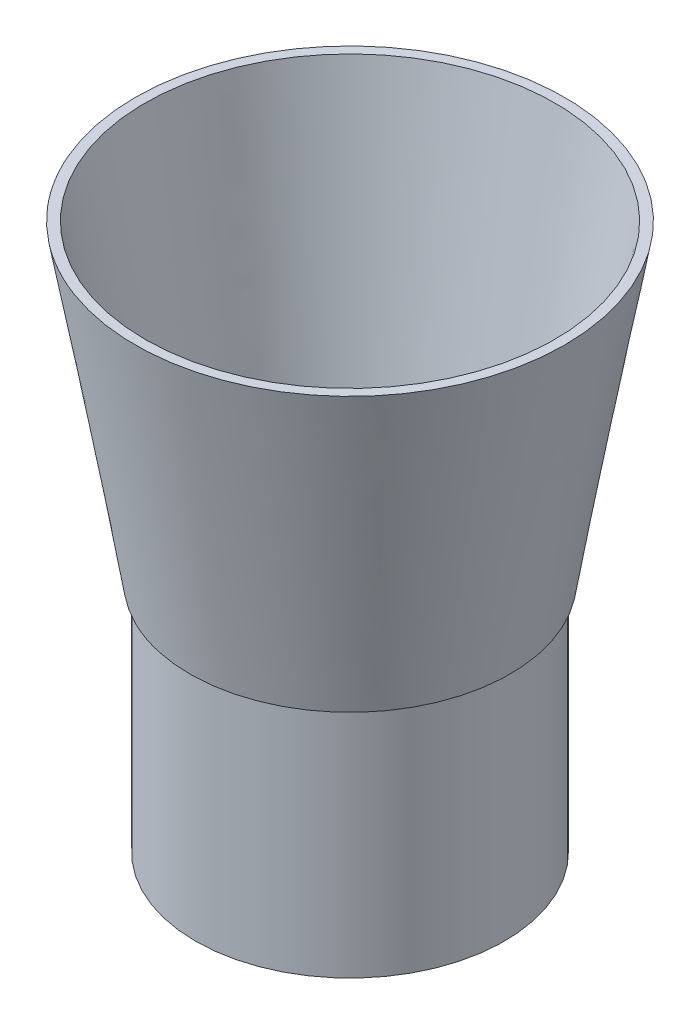
ISO-10303-21;
HEADER;
FILE_DESCRIPTION(('STEP AP214'),'2;1');
FILE_NAME('part.step','',(''),(''),'','','');
FILE_SCHEMA(('AUTOMOTIVE_DESIGN { 1 0 10303 214 1 1 1 1 }'));
ENDSEC;
DATA;
#1=APPLICATION_CONTEXT('core data for automotive mechanical design processes');
#2=APPLICATION_PROTOCOL_DEFINITION('international standard','automotive_design',2000,#1);
#3=PRODUCT_CONTEXT('',#1,'mechanical');
#4=PRODUCT('Part','Part','',(#3));
#5=PRODUCT_RELATED_PRODUCT_CATEGORY('part','',(#4));
#6=PRODUCT_DEFINITION_FORMATION('','',#4);
#7=PRODUCT_DEFINITION_CONTEXT('part definition',#1,'design');
#8=PRODUCT_DEFINITION('design','',#6,#7);
#9=PRODUCT_DEFINITION_SHAPE('','',#8);
#10=(LENGTH_UNIT() NAMED_UNIT(*) SI_UNIT(.MILLI.,.METRE.));
#11=(NAMED_UNIT(*) PLANE_ANGLE_UNIT() SI_UNIT($,.RADIAN.));
#12=(NAMED_UNIT(*) SI_UNIT($,.STERADIAN.) SOLID_ANGLE_UNIT());
#13=UNCERTAINTY_MEASURE_WITH_UNIT(LENGTH_MEASURE(1.E-05),#10,'distance_accuracy_value','');
#14=(GEOMETRIC_REPRESENTATION_CONTEXT(3) GLOBAL_UNCERTAINTY_ASSIGNED_CONTEXT((#13)) GLOBAL_UNIT_ASSIGNED_CONTEXT((#10,
#11,#12)) REPRESENTATION_CONTEXT('',''));
#15=CARTESIAN_POINT('',(0.,0.,0.));
#16=DIRECTION('',(0.,0.,1.));
#17=DIRECTION('',(1.,0.,0.));
#18=AXIS2_PLACEMENT_3D('',#15,#16,#17);
#19=CARTESIAN_POINT('',(0.,-38.1,0.));
#20=DIRECTION('',(0.,1.,0.));
#21=DIRECTION('',(0.,0.,1.));
#22=AXIS2_PLACEMENT_3D('',#19,#20,#21);
#23=CYLINDRICAL_SURFACE('',#22,23.5585);
#24=CARTESIAN_POINT('',(0.,3.175,0.));
#25=DIRECTION('',(0.,-1.,0.));
#26=DIRECTION('',(0.,0.,-1.));
#27=AXIS2_PLACEMENT_3D('',#24,#25,#26);
#28=CIRCLE('',#27,23.5585);
#29=CARTESIAN_POINT('',(0.,3.175,-23.5585));
#30=VERTEX_POINT('',#29);
#31=EDGE_CURVE('E141',#30,#30,#28,.T.);
#32=ORIENTED_EDGE('',*,*,#31,.F.);
#33=EDGE_LOOP('',(#32));
#34=FACE_BOUND('',#33,.T.);
#35=CARTESIAN_POINT('',(0.,-34.925,0.));
#36=DIRECTION('',(0.,1.,0.));
#37=DIRECTION('',(0.,0.,1.));
#38=AXIS2_PLACEMENT_3D('',#35,#36,#37);
#39=CIRCLE('',#38,23.5585);
#40=CARTESIAN_POINT('',(6.35,-34.925,-22.6865692040467));
#41=VERTEX_POINT('',#40);
#42=CARTESIAN_POINT('',(9.525,-34.925,-21.5470948679863));
#43=VERTEX_POINT('',#42);
#44=EDGE_CURVE('E89',#41,#43,#39,.F.);
#45=ORIENTED_EDGE('',*,*,#44,.T.);
#46=DIRECTION('',(0.,1.,0.));
#47=VECTOR('',#46,1.);
#48=CARTESIAN_POINT('',(9.525,-38.1,-21.5470948679863));
#49=LINE('',#48,#47);
#50=CARTESIAN_POINT('',(9.525,-38.1,-21.5470948679863));
#51=VERTEX_POINT('',#50);
#52=EDGE_CURVE('E228',#43,#51,#49,.F.);
#53=ORIENTED_EDGE('',*,*,#52,.T.);
#54=CARTESIAN_POINT('',(0.,-38.1,0.));
#55=DIRECTION('',(0.,-1.,0.));
#56=DIRECTION('',(0.,0.,-1.));
#57=AXIS2_PLACEMENT_3D('',#54,#55,#56);
#58=CIRCLE('',#57,23.5585);
#59=CARTESIAN_POINT('',(9.525,-38.1,21.5470948679863));
#60=VERTEX_POINT('',#59);
#61=EDGE_CURVE('E133',#51,#60,#58,.T.);
#62=ORIENTED_EDGE('',*,*,#61,.T.);
#63=DIRECTION('',(0.,1.,0.));
#64=VECTOR('',#63,1.);
#65=CARTESIAN_POINT('',(9.525,-38.1,21.5470948679863));
#66=LINE('',#65,#64);
#67=CARTESIAN_POINT('',(9.525,-34.925,21.5470948679863));
#68=VERTEX_POINT('',#67);
#69=EDGE_CURVE('E219',#68,#60,#66,.F.);
#70=ORIENTED_EDGE('',*,*,#69,.F.);
#71=CARTESIAN_POINT('',(0.,-34.925,0.));
#72=DIRECTION('',(0.,-1.,0.));
#73=DIRECTION('',(0.,0.,-1.));
#74=AXIS2_PLACEMENT_3D('',#71,#72,#73);
#75=CIRCLE('',#74,23.5585);
#76=CARTESIAN_POINT('',(6.35,-34.925,22.6865692040467));
#77=VERTEX_POINT('',#76);
#78=EDGE_CURVE('E120',#77,#68,#75,.F.);
#79=ORIENTED_EDGE('',*,*,#78,.F.);
#80=DIRECTION('',(0.,1.,0.));
#81=VECTOR('',#80,1.);
#82=CARTESIAN_POINT('',(6.35,-38.1,22.6865692040467));
#83=LINE('',#82,#81);
#84=CARTESIAN_POINT('',(6.35,-38.1,22.6865692040467));
#85=VERTEX_POINT('',#84);
#86=EDGE_CURVE('E131',#85,#77,#83,.T.);
#87=ORIENTED_EDGE('',*,*,#86,.F.);
#88=CARTESIAN_POINT('',(6.35,-38.1,-22.6865692040467));
#89=VERTEX_POINT('',#88);
#90=EDGE_CURVE('E118',#85,#89,#58,.T.);
#91=ORIENTED_EDGE('',*,*,#90,.T.);
#92=DIRECTION('',(0.,1.,0.));
#93=VECTOR('',#92,1.);
#94=CARTESIAN_POINT('',(6.35,-38.1,-22.6865692040467));
#95=LINE('',#94,#93);
#96=EDGE_CURVE('E124',#89,#41,#95,.T.);
#97=ORIENTED_EDGE('',*,*,#96,.T.);
#98=EDGE_LOOP('',(#45,#53,#62,#70,#79,#87,#91,#97));
#99=FACE_BOUND('',#98,.T.);
#100=ADVANCED_FACE('F67',(#34,#99),#23,.F.);
#101=CARTESIAN_POINT('',(0.,50.8,33.3375));
#102=CARTESIAN_POINT('',(0.,33.8666666666667,30.3826333333333));
#103=CARTESIAN_POINT('',(0.,16.9333333333333,27.4277666666667));
#104=CARTESIAN_POINT('',(0.,0.,24.4729));
#105=CARTESIAN_POINT('',(-0.919973332165571,50.8,33.3375));
#106=CARTESIAN_POINT('',(-0.838431568882829,33.8666666666667,30.3826333333333));
#107=CARTESIAN_POINT('',(-0.756889805600086,16.9333333333333,27.4277666666667));
#108=CARTESIAN_POINT('',(-0.675348042317343,0.,24.4729));
#109=CARTESIAN_POINT('',(-2.74261283006359,50.8,33.2628098332166));
#110=CARTESIAN_POINT('',(-2.49952155953858,33.8666666666667,30.3145633235549));
#111=CARTESIAN_POINT('',(-2.25643028901358,16.9333333333333,27.3663168138933));
#112=CARTESIAN_POINT('',(-2.01333901848857,0.,24.4180703042317));
#113=CARTESIAN_POINT('',(-5.41604312755874,50.8,32.9353115327436));
#114=CARTESIAN_POINT('',(-4.93599257479226,33.8666666666667,30.0160928089525));
#115=CARTESIAN_POINT('',(-4.45594202202578,16.9333333333333,27.0968740851614));
#116=CARTESIAN_POINT('',(-3.9758914692593,0.,24.1776553613703));
#117=CARTESIAN_POINT('',(-8.02033702564944,50.8,32.4009576320254));
#118=CARTESIAN_POINT('',(-7.30945508991569,33.8666666666667,29.5291013238154));
#119=CARTESIAN_POINT('',(-6.59857315418193,16.9333333333333,26.6572450156054));
#120=CARTESIAN_POINT('',(-5.88769121844817,0.,23.7853887073954));
#121=CARTESIAN_POINT('',(-23.1796373174517,50.8,28.0053453265603));
#122=CARTESIAN_POINT('',(-21.1251120034731,33.8666666666667,25.5230937661871));
#123=CARTESIAN_POINT('',(-19.0705866894946,16.9333333333333,23.0408422058138));
#124=CARTESIAN_POINT('',(-17.016061375516,0.,20.5585906454406));
#125=CARTESIAN_POINT('',(-33.3375,50.8,14.7195733146491));
#126=CARTESIAN_POINT('',(-30.3826333333333,33.8666666666667,13.4149051021253));
#127=CARTESIAN_POINT('',(-27.4277666666667,16.9333333333333,12.1102368896014));
#128=CARTESIAN_POINT('',(-24.4729,0.,10.8055686770776));
#129=CARTESIAN_POINT('',(-33.3375,50.8,-18.3994666433114));
#130=CARTESIAN_POINT('',(-30.3826333333333,33.8666666666667,-16.7686313776566));
#131=CARTESIAN_POINT('',(-27.4277666666667,16.9333333333333,-15.1377961120018));
#132=CARTESIAN_POINT('',(-24.4729,0.,-13.506960846347));
#133=CARTESIAN_POINT('',(-18.3994666433113,50.8,-33.3375));
#134=CARTESIAN_POINT('',(-16.7686313776566,33.8666666666667,-30.3826333333333));
#135=CARTESIAN_POINT('',(-15.1377961120018,16.9333333333333,-27.4277666666667));
#136=CARTESIAN_POINT('',(-13.506960846347,0.,-24.4729));
#137=CARTESIAN_POINT('',(18.3994666433114,50.8,-33.3375));
#138=CARTESIAN_POINT('',(16.7686313776566,33.8666666666667,-30.3826333333333));
#139=CARTESIAN_POINT('',(15.1377961120018,16.9333333333333,-27.4277666666667));
#140=CARTESIAN_POINT('',(13.506960846347,0.,-24.4729));
#141=CARTESIAN_POINT('',(33.3375,50.8,-18.3994666433113));
#142=CARTESIAN_POINT('',(30.3826333333333,33.8666666666667,-16.7686313776566));
#143=CARTESIAN_POINT('',(27.4277666666667,16.9333333333333,-15.1377961120018));
#144=CARTESIAN_POINT('',(24.4729,0.,-13.506960846347));
#145=CARTESIAN_POINT('',(33.3375,50.8,14.7195733146491));
#146=CARTESIAN_POINT('',(30.3826333333333,33.8666666666667,13.4149051021253));
#147=CARTESIAN_POINT('',(27.4277666666667,16.9333333333333,12.1102368896014));
#148=CARTESIAN_POINT('',(24.4729,0.,10.8055686770776));
#149=CARTESIAN_POINT('',(23.1796373174517,50.8,28.0053453265603));
#150=CARTESIAN_POINT('',(21.1251120034731,33.8666666666667,25.5230937661871));
#151=CARTESIAN_POINT('',(19.0705866894946,16.9333333333333,23.0408422058138));
#152=CARTESIAN_POINT('',(17.016061375516,0.,20.5585906454406));
#153=CARTESIAN_POINT('',(8.02033702564943,50.8,32.4009576320254));
#154=CARTESIAN_POINT('',(7.30945508991568,33.8666666666667,29.5291013238154));
#155=CARTESIAN_POINT('',(6.59857315418193,16.9333333333333,26.6572450156054));
#156=CARTESIAN_POINT('',(5.88769121844818,0.,23.7853887073954));
#157=CARTESIAN_POINT('',(5.41604312755872,50.8,32.9353115327436));
#158=CARTESIAN_POINT('',(4.93599257479225,33.8666666666667,30.0160928089525));
#159=CARTESIAN_POINT('',(4.45594202202578,16.9333333333333,27.0968740851614));
#160=CARTESIAN_POINT('',(3.97589146925931,0.,24.1776553613703));
#161=CARTESIAN_POINT('',(2.74261283006358,50.8,33.2628098332166));
#162=CARTESIAN_POINT('',(2.49952155953858,33.8666666666667,30.3145633235549));
#163=CARTESIAN_POINT('',(2.25643028901359,16.9333333333333,27.3663168138933));
#164=CARTESIAN_POINT('',(2.01333901848859,0.,24.4180703042317));
#165=CARTESIAN_POINT('',(0.919973332165558,50.8,33.3375));
#166=CARTESIAN_POINT('',(0.838431568882823,33.8666666666667,30.3826333333333));
#167=CARTESIAN_POINT('',(0.756889805600089,16.9333333333333,27.4277666666667));
#168=CARTESIAN_POINT('',(0.675348042317355,0.,24.4729));
#169=CARTESIAN_POINT('',(0.,50.8,33.3375));
#170=CARTESIAN_POINT('',(0.,33.8666666666667,30.3826333333333));
#171=CARTESIAN_POINT('',(0.,16.9333333333333,27.4277666666667));
#172=CARTESIAN_POINT('',(0.,0.,24.4729));
#173=B_SPLINE_SURFACE_WITH_KNOTS('',3,3,((#101,#102,#103,#104),(#105,#106,#107,#108),(#109,#110,
#111,#112),(#113,#114,#115,#116),(#117,#118,#119,#120),(#121,#122,#123,#124),(#125,#126,#127,
#128),(#129,#130,#131,#132),(#133,#134,#135,#136),(#137,#138,#139,#140),(#141,#142,#143,#144),
(#145,#146,#147,#148),(#149,#150,#151,#152),(#153,#154,#155,#156),(#157,#158,#159,#160),(#161,
#162,#163,#164),(#165,#166,#167,#168),(#169,#170,#171,#172)),.UNSPECIFIED.,.T.,.F.,.F.,(4,1,1,1,
1,2,2,2,1,1,1,1,4),(4,4),(0.,0.0125,0.0249999999999999,0.0375000000000001,0.05,0.25,0.5,0.75,
0.95,0.9625,0.975,0.9875,1.),(0.,1.),.UNSPECIFIED.);
#174=CARTESIAN_POINT('',(0.,50.8,0.));
#175=DIRECTION('',(0.,1.,0.));
#176=DIRECTION('',(0.,0.,1.));
#177=AXIS2_PLACEMENT_3D('',#174,#175,#176);
#178=CIRCLE('',#177,33.3375);
#179=CARTESIAN_POINT('',(0.,50.8,33.3375));
#180=VERTEX_POINT('',#179);
#181=EDGE_CURVE('E134',#180,#180,#178,.T.);
#182=CARTESIAN_POINT('',(0.,3.175,25.0269375));
#183=CARTESIAN_POINT('',(0.701705374786809,3.175,25.0269450791358));
#184=CARTESIAN_POINT('',(1.40332593919357,3.175,24.9979703096471));
#185=CARTESIAN_POINT('',(2.80190395204648,3.175,24.8814052967105));
#186=CARTESIAN_POINT('',(3.49886037571868,3.175,24.793802573043));
#187=CARTESIAN_POINT('',(4.88344774871142,3.175,24.5599702034702));
#188=CARTESIAN_POINT('',(5.57107065289882,3.175,24.4136929358102));
#189=CARTESIAN_POINT('',(6.93140815670746,3.175,24.0633614426326));
#190=CARTESIAN_POINT('',(7.60412347432298,3.175,23.8593100062429));
#191=CARTESIAN_POINT('',(8.92966468248353,3.175,23.3949707483957));
#192=CARTESIAN_POINT('',(9.58249548724364,3.175,23.1346969524087));
#193=CARTESIAN_POINT('',(10.8638295576875,3.175,22.5599031219465));
#194=CARTESIAN_POINT('',(11.4923324065335,3.175,22.2453821584979));
#195=CARTESIAN_POINT('',(12.7206425581829,3.175,21.5645440630064));
#196=CARTESIAN_POINT('',(13.3204490538441,3.175,21.1982254751969));
#197=CARTESIAN_POINT('',(14.4872332565809,3.175,20.4165938258074));
#198=CARTESIAN_POINT('',(15.0542109534579,3.175,20.0012807490065));
#199=CARTESIAN_POINT('',(16.151705847522,3.175,19.1245342914532));
#200=CARTESIAN_POINT('',(16.6822072014245,3.175,18.66308108091));
#201=CARTESIAN_POINT('',(17.7028340118827,3.175,17.6974981554466));
#202=CARTESIAN_POINT('',(18.1929594395279,3.175,17.1933684099691));
#203=CARTESIAN_POINT('',(19.1293656700937,3.175,16.1459756000086));
#204=CARTESIAN_POINT('',(19.5756496655977,3.175,15.6027153900521));
#205=CARTESIAN_POINT('',(20.4211927838735,3.175,14.4807511432877));
#206=CARTESIAN_POINT('',(20.8204518775619,3.175,13.9020470845592));
#207=CARTESIAN_POINT('',(21.5719453333599,3.175,12.7084096531064));
#208=CARTESIAN_POINT('',(21.9237800305325,3.175,12.0932245371615));
#209=CARTESIAN_POINT('',(22.5738885580254,3.175,10.8351628380949));
#210=CARTESIAN_POINT('',(22.8721617814811,3.175,10.1922859413208));
#211=CARTESIAN_POINT('',(23.4127597488355,3.175,8.88343504046988));
#212=CARTESIAN_POINT('',(23.6550862605962,3.175,8.21746176698131));
#213=CARTESIAN_POINT('',(24.0819019990941,3.175,6.86728174692616));
#214=CARTESIAN_POINT('',(24.2663933458875,3.175,6.18307566971495));
#215=CARTESIAN_POINT('',(24.5744462015117,3.175,4.80944235435561));
#216=CARTESIAN_POINT('',(24.6986981835827,3.175,4.12017093519377));
#217=CARTESIAN_POINT('',(24.8413438765936,3.175,3.0804473073651));
#218=CARTESIAN_POINT('',(24.8816060881447,3.175,2.7328583451482));
#219=CARTESIAN_POINT('',(24.9475716425854,3.175,2.03627767422922));
#220=CARTESIAN_POINT('',(24.9732749406855,3.175,1.68728596121499));
#221=CARTESIAN_POINT('',(25.0101551908636,3.175,0.988502964344132));
#222=CARTESIAN_POINT('',(25.0213304551133,3.175,0.638711592313337));
#223=CARTESIAN_POINT('',(25.0292726430805,3.175,-0.0610345979130219));
#224=CARTESIAN_POINT('',(25.0260395371692,3.175,-0.41098941644321));
#225=CARTESIAN_POINT('',(25.0051053976768,3.175,-1.11046929995766));
#226=CARTESIAN_POINT('',(24.9874045533164,3.175,-1.45999437050264));
#227=CARTESIAN_POINT('',(24.9374551531875,3.175,-2.15797887139648));
#228=CARTESIAN_POINT('',(24.9052066550362,3.175,-2.50643830596038));
#229=CARTESIAN_POINT('',(24.7857190742857,3.175,-3.55690893389024));
#230=CARTESIAN_POINT('',(24.6759561646261,3.175,-4.25650305417016));
#231=CARTESIAN_POINT('',(24.3971906757628,3.175,-5.64369383765209));
#232=CARTESIAN_POINT('',(24.2281882216106,3.175,-6.33129052617681));
#233=CARTESIAN_POINT('',(23.8321029208127,3.175,-7.68938756922116));
#234=CARTESIAN_POINT('',(23.6050345383353,3.175,-8.35989213569754));
#235=CARTESIAN_POINT('',(23.094534455862,3.175,-9.67908365494516));
#236=CARTESIAN_POINT('',(22.811102498739,3.175,-10.3277705081696));
#237=CARTESIAN_POINT('',(22.1937474940205,3.175,-11.5912942814294));
#238=CARTESIAN_POINT('',(21.8604507319811,3.175,-12.2064373792615));
#239=CARTESIAN_POINT('',(21.143566139313,3.175,-13.4066707760422));
#240=CARTESIAN_POINT('',(20.7599788377462,3.175,-13.9917613910559));
#241=CARTESIAN_POINT('',(19.9452571405384,3.175,-15.1280962466419));
#242=CARTESIAN_POINT('',(19.514108956941,3.175,-15.6793305997618));
#243=CARTESIAN_POINT('',(18.607464608722,3.175,-16.7440404425904));
#244=CARTESIAN_POINT('',(18.131967897793,3.175,-17.2575154670215));
#245=CARTESIAN_POINT('',(17.1351947650588,3.175,-18.2479131611413));
#246=CARTESIAN_POINT('',(16.6135230918509,3.175,-18.7244381280088));
#247=CARTESIAN_POINT('',(15.5320065486324,3.175,-19.6320037979131));
#248=CARTESIAN_POINT('',(14.9721615706375,3.175,-20.0630443722753));
#249=CARTESIAN_POINT('',(13.8183204783215,3.175,-20.8763477437594));
#250=CARTESIAN_POINT('',(13.2243338163957,3.175,-21.2586239482244));
#251=CARTESIAN_POINT('',(12.0061745748867,3.175,-21.9716168902826));
#252=CARTESIAN_POINT('',(11.3820020182284,3.175,-22.3023336670323));
#253=CARTESIAN_POINT('',(10.1076464421311,3.175,-22.909702951675));
#254=CARTESIAN_POINT('',(9.45745559072925,3.175,-23.1863390305895));
#255=CARTESIAN_POINT('',(8.13587572870225,3.175,-23.6832316494202));
#256=CARTESIAN_POINT('',(7.46448702690558,3.175,-23.9034890102846));
#257=CARTESIAN_POINT('',(6.10524701529293,3.175,-24.2860071746555));
#258=CARTESIAN_POINT('',(5.41739196756208,3.175,-24.4482546739423));
#259=CARTESIAN_POINT('',(4.03027796055835,3.175,-24.7136538391063));
#260=CARTESIAN_POINT('',(3.33101887692887,3.175,-24.8168048601154));
#261=CARTESIAN_POINT('',(2.28117595352482,3.175,-24.9266140159623));
#262=CARTESIAN_POINT('',(1.93279425772728,3.175,-24.9556959442069));
#263=CARTESIAN_POINT('',(1.2351000266477,3.175,-24.9993510937297));
#264=CARTESIAN_POINT('',(0.885787486619258,3.175,-25.0139242408847));
#265=CARTESIAN_POINT('',(0.186857677899453,3.175,-25.0286612011182));
#266=CARTESIAN_POINT('',(-0.162759592850685,3.175,-25.0288249160792));
#267=CARTESIAN_POINT('',(-0.861681893294125,3.175,-25.0147531982343));
#268=CARTESIAN_POINT('',(-1.21098692422983,3.175,-25.0005178229802));
#269=CARTESIAN_POINT('',(-2.25745466614431,3.175,-24.9360315473256));
#270=CARTESIAN_POINT('',(-2.95341219936817,3.175,-24.8640057166221));
#271=CARTESIAN_POINT('',(-4.33671959442979,3.175,-24.6618007438205));
#272=CARTESIAN_POINT('',(-5.02406975922888,3.175,-24.5316236544728));
#273=CARTESIAN_POINT('',(-6.39348371861801,3.175,-24.211858581206));
#274=CARTESIAN_POINT('',(-7.07538705483904,3.175,-24.0215814831043));
#275=CARTESIAN_POINT('',(-8.42046568849581,3.175,-23.5834790981609));
#276=CARTESIAN_POINT('',(-9.0836403092061,3.175,-23.3356517348295));
#277=CARTESIAN_POINT('',(-10.3864834893898,3.175,-22.7843802136252));
#278=CARTESIAN_POINT('',(-11.0261510894396,3.175,-22.4809337887165));
#279=CARTESIAN_POINT('',(-12.2774063867041,3.175,-21.82084477719));
#280=CARTESIAN_POINT('',(-12.8889944420436,3.175,-21.4642028692707));
#281=CARTESIAN_POINT('',(-14.0734216589049,3.175,-20.7046125611268));
#282=CARTESIAN_POINT('',(-14.6466067443244,3.175,-20.3022032754114));
#283=CARTESIAN_POINT('',(-15.7574427237345,3.175,-19.4510211815663));
#284=CARTESIAN_POINT('',(-16.2950938016161,3.175,-19.0022486134008));
#285=CARTESIAN_POINT('',(-17.3312656390269,3.175,-18.0614881842885));
#286=CARTESIAN_POINT('',(-17.8297819247501,3.175,-17.5694953960821));
#287=CARTESIAN_POINT('',(-18.7841729738812,3.175,-16.5457496717589));
#288=CARTESIAN_POINT('',(-19.2400473527359,3.175,-16.0139963771518));
#289=CARTESIAN_POINT('',(-20.1110083232271,3.175,-14.9078819526425));
#290=CARTESIAN_POINT('',(-20.5255522001033,3.175,-14.3330932924349));
#291=CARTESIAN_POINT('',(-21.3045515347232,3.175,-13.1505127058323));
#292=CARTESIAN_POINT('',(-21.6690066806883,3.175,-12.5427205740391));
#293=CARTESIAN_POINT('',(-22.3449070021907,3.175,-11.2985286197747));
#294=CARTESIAN_POINT('',(-22.6563656639127,3.175,-10.6621361275934));
#295=CARTESIAN_POINT('',(-23.2239017468371,3.175,-9.3651446778615));
#296=CARTESIAN_POINT('',(-23.4799797673799,3.175,-8.70454598236577));
#297=CARTESIAN_POINT('',(-23.9330459815379,3.175,-7.36884948461068));
#298=CARTESIAN_POINT('',(-24.1304654032092,3.175,-6.69389867210003));
#299=CARTESIAN_POINT('',(-24.3830968551597,3.175,-5.67096950589377));
#300=CARTESIAN_POINT('',(-24.4600600180103,3.175,-5.32822817757063));
#301=CARTESIAN_POINT('',(-24.5994243953554,3.175,-4.63970953039639));
#302=CARTESIAN_POINT('',(-24.661822097251,3.175,-4.29393150003414));
#303=CARTESIAN_POINT('',(-24.8270086307116,3.175,-3.25301512699823));
#304=CARTESIAN_POINT('',(-24.9077970417377,3.175,-2.5542695624095));
#305=CARTESIAN_POINT('',(-25.0106311677722,3.175,-1.15246685249484));
#306=CARTESIAN_POINT('',(-25.0326743499363,3.175,-0.449409522573803));
#307=CARTESIAN_POINT('',(-25.02217907842,3.175,0.604954245986891));
#308=CARTESIAN_POINT('',(-25.0114001490469,3.175,0.956592735264008));
#309=CARTESIAN_POINT('',(-24.9751653938538,3.175,1.65911189859596));
#310=CARTESIAN_POINT('',(-24.9497095878077,3.175,2.00999257367116));
#311=CARTESIAN_POINT('',(-24.85124522667,3.175,3.0605004747403));
#312=CARTESIAN_POINT('',(-24.7561378673959,3.175,3.75818990576825));
#313=CARTESIAN_POINT('',(-24.507227570891,3.175,5.14270387810632));
#314=CARTESIAN_POINT('',(-24.353443587067,3.175,5.8295318532947));
#315=CARTESIAN_POINT('',(-23.9881017493442,3.175,7.18768942292545));
#316=CARTESIAN_POINT('',(-23.7765426060889,3.175,7.85901867112323));
#317=CARTESIAN_POINT('',(-23.2975051565529,3.175,9.18050370215012));
#318=CARTESIAN_POINT('',(-23.030093801185,3.175,9.83068376803472));
#319=CARTESIAN_POINT('',(-22.4412880751522,3.175,11.1061163165658));
#320=CARTESIAN_POINT('',(-22.1198937880044,3.175,11.7313688377758));
#321=CARTESIAN_POINT('',(-21.4255498046442,3.175,12.9527404430437));
#322=CARTESIAN_POINT('',(-21.0525883836637,3.175,13.5488528597041));
#323=CARTESIAN_POINT('',(-20.2580013016942,3.175,14.7077066612201));
#324=CARTESIAN_POINT('',(-19.8363754337913,3.175,15.270447904171));
#325=CARTESIAN_POINT('',(-18.9474417263772,3.175,16.3588570453129));
#326=CARTESIAN_POINT('',(-18.4801217881599,3.175,16.8845150609755));
#327=CARTESIAN_POINT('',(-17.5032182270571,3.175,17.8949719243631));
#328=CARTESIAN_POINT('',(-16.9936345061166,3.175,18.3797706772862));
#329=CARTESIAN_POINT('',(-15.9356457839046,3.175,19.305179542357));
#330=CARTESIAN_POINT('',(-15.3872338975528,3.175,19.745781783855));
#331=CARTESIAN_POINT('',(-14.2554343367315,3.175,20.5794968534423));
#332=CARTESIAN_POINT('',(-13.6720470830605,3.175,20.9726102527118));
#333=CARTESIAN_POINT('',(-12.4695772591685,3.175,21.7112903124134));
#334=CARTESIAN_POINT('',(-11.8502505469095,3.175,22.0564597419524));
#335=CARTESIAN_POINT('',(-10.5844285441314,3.175,22.6928718782398));
#336=CARTESIAN_POINT('',(-9.9379314461459,3.175,22.984110990371));
#337=CARTESIAN_POINT('',(-8.62320432415374,3.175,23.5099956299683));
#338=CARTESIAN_POINT('',(-7.95500149141297,3.175,23.7447090842491));
#339=CARTESIAN_POINT('',(-6.60121052546885,3.175,24.1561220046403));
#340=CARTESIAN_POINT('',(-5.91562714036711,3.175,24.3328371348958));
#341=CARTESIAN_POINT('',(-4.36603033402228,3.175,24.6623880064683));
#342=CARTESIAN_POINT('',(-3.49860223323708,3.175,24.7993724949378));
#343=CARTESIAN_POINT('',(-1.75407301251944,3.175,24.981650304784));
#344=CARTESIAN_POINT('',(-0.87697027253916,3.175,25.026928027824));
#345=CARTESIAN_POINT('',(0.,3.175,25.0269375));
#346=B_SPLINE_CURVE_WITH_KNOTS('',3,(#182,#183,#184,#185,#186,#187,#188,#189,#190,#191,#192,
#193,#194,#195,#196,#197,#198,#199,#200,#201,#202,#203,#204,#205,#206,#207,#208,#209,#210,#211,
#212,#213,#214,#215,#216,#217,#218,#219,#220,#221,#222,#223,#224,#225,#226,#227,#228,#229,#230,
#231,#232,#233,#234,#235,#236,#237,#238,#239,#240,#241,#242,#243,#244,#245,#246,#247,#248,#249,
#250,#251,#252,#253,#254,#255,#256,#257,#258,#259,#260,#261,#262,#263,#264,#265,#266,#267,#268,
#269,#270,#271,#272,#273,#274,#275,#276,#277,#278,#279,#280,#281,#282,#283,#284,#285,#286,#287,
#288,#289,#290,#291,#292,#293,#294,#295,#296,#297,#298,#299,#300,#301,#302,#303,#304,#305,#306,
#307,#308,#309,#310,#311,#312,#313,#314,#315,#316,#317,#318,#319,#320,#321,#322,#323,#324,#325,
#326,#327,#328,#329,#330,#331,#332,#333,#334,#335,#336,#337,#338,#339,#340,#341,#342,#343,#344,
#345),.UNSPECIFIED.,.T.,.F.,(4,2,2,2,2,2,2,2,2,2,2,2,2,2,2,2,2,2,2,2,2,2,2,2,2,2,2,2,2,2,2,2,2,
2,2,2,2,2,2,2,2,2,2,2,2,2,2,2,2,2,2,2,2,2,2,2,2,2,2,2,2,2,2,2,2,2,2,2,2,2,2,2,2,2,2,2,2,2,2,2,2,
4),(0.,2.10434977682889,4.20914765226579,6.31565730310995,8.42206527662451,10.5279483821871,
12.6338675542106,14.7398459246264,16.8458249492913,18.9527129895846,21.0596025384718,
23.1663385473345,25.2730758591369,27.3965847881754,29.5201177755752,31.6435836522059,
33.7669716801148,35.8654091865468,36.9148974773471,37.9643889968178,39.0140024325347,
40.0636180266332,41.1132198932296,42.1628176028253,44.2844795709549,46.4061370603974,
48.5272665608913,50.648405738065,52.7448486437667,54.8412694964338,56.9382997091733,
59.0353557575875,61.1525199710429,63.269690173761,65.3862770183758,67.5028622555501,
69.6200894866838,71.7372858864477,73.8549675417183,75.9726723049492,77.0212051394018,
78.0697433306255,79.1182886616068,80.1668298016723,82.2631876295963,84.35947146154,
86.4807218776041,88.6020488430855,90.7234622931966,92.8448486794064,94.9434260238749,
97.0419925071987,99.1407985458623,101.239623510152,103.363130821049,105.48665134917,
107.609630687447,109.732587049268,111.839526740498,112.893084075029,113.946895223002,
116.054440709256,118.162077062439,119.217222409164,120.272366334305,122.382067041517,
124.491086860711,126.600153750318,128.706706831284,130.813256653237,132.920286229398,
135.027324764663,137.134922712319,139.242525549897,141.350503051958,143.458455197435,
145.582945520405,147.707577396088,149.829643219805,151.951135444991,154.580641291331,
157.210594350853),.UNSPECIFIED.);
#347=CARTESIAN_POINT('',(0.,3.175,25.0269375));
#348=VERTEX_POINT('',#347);
#349=EDGE_CURVE('E13',#348,#348,#346,.T.);
#350=ORIENTED_EDGE('',*,*,#181,.T.);
#351=EDGE_LOOP('',(#350));
#352=FACE_BOUND('',#351,.T.);
#353=ORIENTED_EDGE('',*,*,#349,.F.);
#354=EDGE_LOOP('',(#353));
#355=FACE_BOUND('',#354,.T.);
#356=ADVANCED_FACE('F188',(#352,#355),#173,.F.);
#357=CARTESIAN_POINT('',(0.,50.8,0.));
#358=DIRECTION('',(0.,1.,0.));
#359=DIRECTION('',(0.,0.,1.));
#360=AXIS2_PLACEMENT_3D('',#357,#358,#359);
#361=PLANE('',#360);
#362=ORIENTED_EDGE('',*,*,#181,.F.);
#363=EDGE_LOOP('',(#362));
#364=FACE_BOUND('',#363,.T.);
#365=CARTESIAN_POINT('',(0.,50.8,0.));
#366=DIRECTION('',(0.,1.,0.));
#367=DIRECTION('',(0.,0.,1.));
#368=AXIS2_PLACEMENT_3D('',#365,#366,#367);
#369=CIRCLE('',#368,34.925);
#370=CARTESIAN_POINT('',(24.0672997579281,50.8,-25.3085105717826));
#371=VERTEX_POINT('',#370);
#372=EDGE_CURVE('E154',#371,#371,#369,.T.);
#373=ORIENTED_EDGE('',*,*,#372,.T.);
#374=EDGE_LOOP('',(#373));
#375=FACE_BOUND('',#374,.T.);
#376=ADVANCED_FACE('F69',(#364,#375),#361,.T.);
#377=CARTESIAN_POINT('',(0.,0.,0.));
#378=DIRECTION('',(0.,1.,0.));
#379=DIRECTION('',(0.,0.,1.));
#380=AXIS2_PLACEMENT_3D('',#377,#378,#379);
#381=PLANE('',#380);
#382=CARTESIAN_POINT('',(0.,0.,0.));
#383=DIRECTION('',(0.,1.,0.));
#384=DIRECTION('',(0.,0.,1.));
#385=AXIS2_PLACEMENT_3D('',#382,#383,#384);
#386=CIRCLE('',#385,25.146);
#387=CARTESIAN_POINT('',(0.,0.,25.146));
#388=VERTEX_POINT('',#387);
#389=EDGE_CURVE('E82',#388,#388,#386,.F.);
#390=ORIENTED_EDGE('',*,*,#389,.F.);
#391=EDGE_LOOP('',(#390));
#392=FACE_BOUND('',#391,.T.);
#393=CARTESIAN_POINT('',(0.,0.,0.));
#394=DIRECTION('',(0.,1.,0.));
#395=DIRECTION('',(0.,0.,1.));
#396=AXIS2_PLACEMENT_3D('',#393,#394,#395);
#397=CIRCLE('',#396,26.0604);
#398=CARTESIAN_POINT('',(13.9776830721426,0.,-21.9947453746284));
#399=VERTEX_POINT('',#398);
#400=EDGE_CURVE('E149',#399,#399,#397,.T.);
#401=ORIENTED_EDGE('',*,*,#400,.F.);
#402=EDGE_LOOP('',(#401));
#403=FACE_BOUND('',#402,.T.);
#404=ADVANCED_FACE('F170',(#392,#403),#381,.F.);
#405=CARTESIAN_POINT('',(13.9776830721426,0.,-21.9947453746284));
#406=CARTESIAN_POINT('',(24.0672997579281,50.8,-25.3085105717826));
#407=CARTESIAN_POINT('',(-30.0118076771142,0.,-49.9501115189136));
#408=CARTESIAN_POINT('',(-26.5497213856371,50.8,-73.4431100876389));
#409=CARTESIAN_POINT('',(-57.9671738213994,0.,-5.96062076965677));
#410=CARTESIAN_POINT('',(-74.6843209014934,50.8,-22.8260889440737));
#411=CARTESIAN_POINT('',(-13.9776830721426,0.,21.9947453746284));
#412=CARTESIAN_POINT('',(-24.0672997579281,50.8,25.3085105717826));
#413=CARTESIAN_POINT('',(30.0118076771142,0.,49.9501115189136));
#414=CARTESIAN_POINT('',(26.5497213856371,50.8,73.4431100876389));
#415=CARTESIAN_POINT('',(57.9671738213994,0.,5.96062076965677));
#416=CARTESIAN_POINT('',(74.6843209014934,50.8,22.8260889440736));
#417=CARTESIAN_POINT('',(13.9776830721426,0.,-21.9947453746284));
#418=CARTESIAN_POINT('',(24.0672997579281,50.8,-25.3085105717826));
#419=(BOUNDED_SURFACE() B_SPLINE_SURFACE(3,1,((#405,#406),(#407,#408),(#409,#410),(#411,#412),
(#413,#414),(#415,#416),(#417,#418)),.UNSPECIFIED.,.T.,.F.,.F.) B_SPLINE_SURFACE_WITH_KNOTS((4,
3,4),(2,2),(0.,0.5,1.),(0.,1.),
.UNSPECIFIED.) GEOMETRIC_REPRESENTATION_ITEM() RATIONAL_B_SPLINE_SURFACE(((1.,1.),
(0.333333333333333,0.333333333333333),(0.333333333333333,0.333333333333333),(1.,1.),
(0.333333333333333,0.333333333333333),(0.333333333333333,0.333333333333333),(1.,1.))) REPRESENTATION_ITEM('') SURFACE());
#420=CARTESIAN_POINT('',(13.9776830721426,0.,-21.9947453746284));
#421=CARTESIAN_POINT('',(14.0827832459529,0.529166666666666,-22.0292637620988));
#422=CARTESIAN_POINT('',(14.1878834197631,1.05833333333333,-22.0637821495691));
#423=CARTESIAN_POINT('',(14.3980837673837,2.11666666666667,-22.1328189245098));
#424=CARTESIAN_POINT('',(14.5031839411939,2.64583333333333,-22.1673373119802));
#425=CARTESIAN_POINT('',(14.7133842888145,3.70416666666667,-22.2363740869209));
#426=CARTESIAN_POINT('',(14.8184844626247,4.23333333333333,-22.2708924743913));
#427=CARTESIAN_POINT('',(15.0286848102453,5.29166666666667,-22.339929249332));
#428=CARTESIAN_POINT('',(15.1337849840555,5.82083333333333,-22.3744476368023));
#429=CARTESIAN_POINT('',(15.3439853316761,6.87916666666667,-22.4434844117431));
#430=CARTESIAN_POINT('',(15.4490855054863,7.40833333333333,-22.4780027992134));
#431=CARTESIAN_POINT('',(15.6592858531069,8.46666666666667,-22.5470395741541));
#432=CARTESIAN_POINT('',(15.7643860269171,8.99583333333333,-22.5815579616245));
#433=CARTESIAN_POINT('',(15.9745863745377,10.0541666666667,-22.6505947365652));
#434=CARTESIAN_POINT('',(16.0796865483479,10.5833333333333,-22.6851131240355));
#435=CARTESIAN_POINT('',(16.2898868959684,11.6416666666667,-22.7541498989763));
#436=CARTESIAN_POINT('',(16.3949870697787,12.1708333333333,-22.7886682864466));
#437=CARTESIAN_POINT('',(16.6051874173992,13.2291666666667,-22.8577050613873));
#438=CARTESIAN_POINT('',(16.7102875912095,13.7583333333333,-22.8922234488577));
#439=CARTESIAN_POINT('',(16.92048793883,14.8166666666667,-22.9612602237984));
#440=CARTESIAN_POINT('',(17.0255881126403,15.3458333333333,-22.9957786112687));
#441=CARTESIAN_POINT('',(17.2357884602608,16.4041666666667,-23.0648153862095));
#442=CARTESIAN_POINT('',(17.3408886340711,16.9333333333333,-23.0993337736798));
#443=CARTESIAN_POINT('',(17.5510889816916,17.9916666666667,-23.1683705486205));
#444=CARTESIAN_POINT('',(17.6561891555019,18.5208333333333,-23.2028889360909));
#445=CARTESIAN_POINT('',(17.8663895031224,19.5791666666667,-23.2719257110316));
#446=CARTESIAN_POINT('',(17.9714896769327,20.1083333333333,-23.306444098502));
#447=CARTESIAN_POINT('',(18.1816900245532,21.1666666666667,-23.3754808734427));
#448=CARTESIAN_POINT('',(18.2867901983635,21.6958333333333,-23.409999260913));
#449=CARTESIAN_POINT('',(18.496990545984,22.7541666666667,-23.4790360358537));
#450=CARTESIAN_POINT('',(18.6020907197943,23.2833333333333,-23.5135544233241));
#451=CARTESIAN_POINT('',(18.8122910674148,24.3416666666667,-23.5825911982648));
#452=CARTESIAN_POINT('',(18.9173912412251,24.8708333333333,-23.6171095857352));
#453=CARTESIAN_POINT('',(19.1275915888456,25.9291666666667,-23.6861463606759));
#454=CARTESIAN_POINT('',(19.2326917626559,26.4583333333333,-23.7206647481462));
#455=CARTESIAN_POINT('',(19.4428921102764,27.5166666666667,-23.7897015230869));
#456=CARTESIAN_POINT('',(19.5479922840867,28.0458333333333,-23.8242199105573));
#457=CARTESIAN_POINT('',(19.7581926317072,29.1041666666667,-23.893256685498));
#458=CARTESIAN_POINT('',(19.8632928055175,29.6333333333333,-23.9277750729684));
#459=CARTESIAN_POINT('',(20.073493153138,30.6916666666667,-23.9968118479091));
#460=CARTESIAN_POINT('',(20.1785933269483,31.2208333333333,-24.0313302353794));
#461=CARTESIAN_POINT('',(20.3887936745688,32.2791666666667,-24.1003670103201));
#462=CARTESIAN_POINT('',(20.4938938483791,32.8083333333333,-24.1348853977905));
#463=CARTESIAN_POINT('',(20.7040941959996,33.8666666666667,-24.2039221727312));
#464=CARTESIAN_POINT('',(20.8091943698099,34.3958333333333,-24.2384405602016));
#465=CARTESIAN_POINT('',(21.0193947174304,35.4541666666667,-24.3074773351423));
#466=CARTESIAN_POINT('',(21.1244948912407,35.9833333333333,-24.3419957226126));
#467=CARTESIAN_POINT('',(21.3346952388612,37.0416666666667,-24.4110324975533));
#468=CARTESIAN_POINT('',(21.4397954126715,37.5708333333333,-24.4455508850237));
#469=CARTESIAN_POINT('',(21.649995760292,38.6291666666667,-24.5145876599644));
#470=CARTESIAN_POINT('',(21.7550959341023,39.1583333333333,-24.5491060474348));
#471=CARTESIAN_POINT('',(21.9652962817228,40.2166666666667,-24.6181428223755));
#472=CARTESIAN_POINT('',(22.0703964555331,40.7458333333333,-24.6526612098458));
#473=CARTESIAN_POINT('',(22.2805968031536,41.8041666666667,-24.7216979847865));
#474=CARTESIAN_POINT('',(22.3856969769639,42.3333333333333,-24.7562163722569));
#475=CARTESIAN_POINT('',(22.5958973245844,43.3916666666667,-24.8252531471976));
#476=CARTESIAN_POINT('',(22.7009974983947,43.9208333333333,-24.859771534668));
#477=CARTESIAN_POINT('',(22.9111978460152,44.9791666666667,-24.9288083096087));
#478=CARTESIAN_POINT('',(23.0162980198255,45.5083333333333,-24.963326697079));
#479=CARTESIAN_POINT('',(23.226498367446,46.5666666666667,-25.0323634720198));
#480=CARTESIAN_POINT('',(23.3315985412563,47.0958333333333,-25.0668818594901));
#481=CARTESIAN_POINT('',(23.5417988888768,48.1541666666667,-25.1359186344308));
#482=CARTESIAN_POINT('',(23.6468990626871,48.6833333333333,-25.1704370219012));
#483=CARTESIAN_POINT('',(23.8570994103076,49.7416666666667,-25.2394737968419));
#484=CARTESIAN_POINT('',(23.9621995841179,50.2708333333333,-25.2739921843122));
#485=CARTESIAN_POINT('',(24.0672997579281,50.8,-25.3085105717826));
#486=B_SPLINE_CURVE_WITH_KNOTS('',3,(#420,#421,#422,#423,#424,#425,#426,#427,#428,#429,#430,
#431,#432,#433,#434,#435,#436,#437,#438,#439,#440,#441,#442,#443,#444,#445,#446,#447,#448,#449,
#450,#451,#452,#453,#454,#455,#456,#457,#458,#459,#460,#461,#462,#463,#464,#465,#466,#467,#468,
#469,#470,#471,#472,#473,#474,#475,#476,#477,#478,#479,#480,#481,#482,#483,#484,#485),
.UNSPECIFIED.,.F.,.F.,(4,2,2,2,2,2,2,2,2,2,2,2,2,2,2,2,2,2,2,2,2,2,2,2,2,2,2,2,2,2,2,2,4),(0.,
1.6218182205403,3.24363644108061,4.86545466162091,6.48727288216121,8.10909110270152,
9.73090932324182,11.3527275437821,12.9745457643224,14.5963639848627,16.218182205403,
17.8400004259433,19.4618186464836,21.0836368670239,22.7054550875642,24.3272733081045,
25.9490915286448,27.5709097491852,29.1927279697255,30.8145461902658,32.4363644108061,
34.0581826313464,35.6800008518867,37.301819072427,38.9236372929673,40.5454555135076,
42.1672737340479,43.7890919545882,45.4109101751285,47.0327283956688,48.6545466162091,
50.2763648367494,51.8981830572897),.UNSPECIFIED.);
#487=EDGE_CURVE('BSEAM159',#399,#371,#486,.T.);
#488=ORIENTED_EDGE('',*,*,#400,.T.);
#489=ORIENTED_EDGE('',*,*,#372,.F.);
#490=ORIENTED_EDGE('',*,*,#487,.T.);
#491=ORIENTED_EDGE('',*,*,#487,.F.);
#492=EDGE_LOOP('',(#488,#490,#489,#491));
#493=FACE_BOUND('',#492,.T.);
#494=ADVANCED_FACE('F159',(#493),#419,.T.);
#495=CARTESIAN_POINT('',(0.,-38.1,0.));
#496=DIRECTION('',(0.,-1.,0.));
#497=DIRECTION('',(0.,0.,-1.));
#498=AXIS2_PLACEMENT_3D('',#495,#496,#497);
#499=PLANE('',#498);
#500=ORIENTED_EDGE('',*,*,#90,.F.);
#501=DIRECTION('',(0.,0.,-1.));
#502=VECTOR('',#501,1.);
#503=CARTESIAN_POINT('',(6.35,-38.1,40.9406601391165));
#504=LINE('',#503,#502);
#505=EDGE_CURVE('E97',#85,#89,#504,.T.);
#506=ORIENTED_EDGE('',*,*,#505,.T.);
#507=EDGE_LOOP('',(#500,#506));
#508=FACE_BOUND('',#507,.T.);
#509=CARTESIAN_POINT('',(0.,-38.1,0.));
#510=DIRECTION('',(0.,-1.,0.));
#511=DIRECTION('',(0.,0.,-1.));
#512=AXIS2_PLACEMENT_3D('',#509,#510,#511);
#513=CIRCLE('',#512,25.146);
#514=CARTESIAN_POINT('',(0.,-38.1,25.146));
#515=VERTEX_POINT('',#514);
#516=EDGE_CURVE('E139',#515,#515,#513,.T.);
#517=ORIENTED_EDGE('',*,*,#516,.T.);
#518=EDGE_LOOP('',(#517));
#519=FACE_BOUND('',#518,.T.);
#520=ORIENTED_EDGE('',*,*,#61,.F.);
#521=DIRECTION('',(0.,0.,-1.));
#522=VECTOR('',#521,1.);
#523=CARTESIAN_POINT('',(9.525,-38.1,40.9406601391165));
#524=LINE('',#523,#522);
#525=EDGE_CURVE('E121',#60,#51,#524,.T.);
#526=ORIENTED_EDGE('',*,*,#525,.F.);
#527=EDGE_LOOP('',(#520,#526));
#528=FACE_BOUND('',#527,.T.);
#529=ADVANCED_FACE('F115',(#508,#519,#528),#499,.T.);
#530=CARTESIAN_POINT('',(0.,-38.1,0.));
#531=DIRECTION('',(0.,1.,0.));
#532=DIRECTION('',(0.,0.,1.));
#533=AXIS2_PLACEMENT_3D('',#530,#531,#532);
#534=CYLINDRICAL_SURFACE('',#533,25.146);
#535=CARTESIAN_POINT('',(0.,-38.1,25.146));
#536=CARTESIAN_POINT('',(0.,-37.703125,25.146));
#537=CARTESIAN_POINT('',(0.,-37.30625,25.146));
#538=CARTESIAN_POINT('',(0.,-36.5125,25.146));
#539=CARTESIAN_POINT('',(0.,-36.115625,25.146));
#540=CARTESIAN_POINT('',(0.,-35.321875,25.146));
#541=CARTESIAN_POINT('',(0.,-34.925,25.146));
#542=CARTESIAN_POINT('',(0.,-34.13125,25.146));
#543=CARTESIAN_POINT('',(0.,-33.734375,25.146));
#544=CARTESIAN_POINT('',(0.,-32.940625,25.146));
#545=CARTESIAN_POINT('',(0.,-32.54375,25.146));
#546=CARTESIAN_POINT('',(0.,-31.75,25.146));
#547=CARTESIAN_POINT('',(0.,-31.353125,25.146));
#548=CARTESIAN_POINT('',(0.,-30.559375,25.146));
#549=CARTESIAN_POINT('',(0.,-30.1625,25.146));
#550=CARTESIAN_POINT('',(0.,-29.36875,25.146));
#551=CARTESIAN_POINT('',(0.,-28.971875,25.146));
#552=CARTESIAN_POINT('',(0.,-28.178125,25.146));
#553=CARTESIAN_POINT('',(0.,-27.78125,25.146));
#554=CARTESIAN_POINT('',(0.,-26.9875,25.146));
#555=CARTESIAN_POINT('',(0.,-26.590625,25.146));
#556=CARTESIAN_POINT('',(0.,-25.796875,25.146));
#557=CARTESIAN_POINT('',(0.,-25.4,25.146));
#558=CARTESIAN_POINT('',(0.,-24.60625,25.146));
#559=CARTESIAN_POINT('',(0.,-24.209375,25.146));
#560=CARTESIAN_POINT('',(0.,-23.415625,25.146));
#561=CARTESIAN_POINT('',(0.,-23.01875,25.146));
#562=CARTESIAN_POINT('',(0.,-22.225,25.146));
#563=CARTESIAN_POINT('',(0.,-21.828125,25.146));
#564=CARTESIAN_POINT('',(0.,-21.034375,25.146));
#565=CARTESIAN_POINT('',(0.,-20.6375,25.146));
#566=CARTESIAN_POINT('',(0.,-19.84375,25.146));
#567=CARTESIAN_POINT('',(0.,-19.446875,25.146));
#568=CARTESIAN_POINT('',(0.,-18.653125,25.146));
#569=CARTESIAN_POINT('',(0.,-18.25625,25.146));
#570=CARTESIAN_POINT('',(0.,-17.4625,25.146));
#571=CARTESIAN_POINT('',(0.,-17.065625,25.146));
#572=CARTESIAN_POINT('',(0.,-16.271875,25.146));
#573=CARTESIAN_POINT('',(0.,-15.875,25.146));
#574=CARTESIAN_POINT('',(0.,-15.08125,25.146));
#575=CARTESIAN_POINT('',(0.,-14.684375,25.146));
#576=CARTESIAN_POINT('',(0.,-13.890625,25.146));
#577=CARTESIAN_POINT('',(0.,-13.49375,25.146));
#578=CARTESIAN_POINT('',(0.,-12.7,25.146));
#579=CARTESIAN_POINT('',(0.,-12.303125,25.146));
#580=CARTESIAN_POINT('',(0.,-11.509375,25.146));
#581=CARTESIAN_POINT('',(0.,-11.1125,25.146));
#582=CARTESIAN_POINT('',(0.,-10.31875,25.146));
#583=CARTESIAN_POINT('',(0.,-9.92187499999999,25.146));
#584=CARTESIAN_POINT('',(0.,-9.128125,25.146));
#585=CARTESIAN_POINT('',(0.,-8.73124999999999,25.146));
#586=CARTESIAN_POINT('',(0.,-7.93749999999999,25.146));
#587=CARTESIAN_POINT('',(0.,-7.54062499999999,25.146));
#588=CARTESIAN_POINT('',(0.,-6.746875,25.146));
#589=CARTESIAN_POINT('',(0.,-6.35,25.146));
#590=CARTESIAN_POINT('',(0.,-5.55625,25.146));
#591=CARTESIAN_POINT('',(0.,-5.159375,25.146));
#592=CARTESIAN_POINT('',(0.,-4.365625,25.146));
#593=CARTESIAN_POINT('',(0.,-3.96875,25.146));
#594=CARTESIAN_POINT('',(0.,-3.175,25.146));
#595=CARTESIAN_POINT('',(0.,-2.778125,25.146));
#596=CARTESIAN_POINT('',(0.,-1.984375,25.146));
#597=CARTESIAN_POINT('',(0.,-1.5875,25.146));
#598=CARTESIAN_POINT('',(0.,-0.79375,25.146));
#599=CARTESIAN_POINT('',(0.,-0.396875,25.146));
#600=CARTESIAN_POINT('',(0.,0.,25.146));
#601=B_SPLINE_CURVE_WITH_KNOTS('',3,(#535,#536,#537,#538,#539,#540,#541,#542,#543,#544,#545,
#546,#547,#548,#549,#550,#551,#552,#553,#554,#555,#556,#557,#558,#559,#560,#561,#562,#563,#564,
#565,#566,#567,#568,#569,#570,#571,#572,#573,#574,#575,#576,#577,#578,#579,#580,#581,#582,#583,
#584,#585,#586,#587,#588,#589,#590,#591,#592,#593,#594,#595,#596,#597,#598,#599,#600),
.UNSPECIFIED.,.F.,.F.,(4,2,2,2,2,2,2,2,2,2,2,2,2,2,2,2,2,2,2,2,2,2,2,2,2,2,2,2,2,2,2,2,4),(0.,
1.190625,2.38125,3.571875,4.7625,5.953125,7.14375,8.334375,9.52500000000001,10.715625,11.90625,
13.096875,14.2875,15.478125,16.66875,17.859375,19.05,20.240625,21.43125,22.621875,23.8125,
25.003125,26.19375,27.384375,28.575,29.765625,30.95625,32.146875,33.3375,34.528125,35.71875,
36.909375,38.1),.UNSPECIFIED.);
#602=EDGE_CURVE('BSEAM180',#515,#388,#601,.T.);
#603=ORIENTED_EDGE('',*,*,#516,.F.);
#604=ORIENTED_EDGE('',*,*,#389,.T.);
#605=ORIENTED_EDGE('',*,*,#602,.T.);
#606=ORIENTED_EDGE('',*,*,#602,.F.);
#607=EDGE_LOOP('',(#603,#605,#604,#606));
#608=FACE_BOUND('',#607,.T.);
#609=ADVANCED_FACE('F180',(#608),#534,.T.);
#610=CARTESIAN_POINT('',(0.,3.175,0.));
#611=DIRECTION('',(0.,-1.,0.));
#612=DIRECTION('',(0.,0.,-1.));
#613=AXIS2_PLACEMENT_3D('',#610,#611,#612);
#614=PLANE('',#613);
#615=ORIENTED_EDGE('',*,*,#31,.T.);
#616=EDGE_LOOP('',(#615));
#617=FACE_BOUND('',#616,.T.);
#618=ORIENTED_EDGE('',*,*,#349,.T.);
#619=EDGE_LOOP('',(#618));
#620=FACE_BOUND('',#619,.T.);
#621=ADVANCED_FACE('F183',(#617,#620),#614,.F.);
#622=CARTESIAN_POINT('',(6.35,-34.925,40.9406601391165));
#623=DIRECTION('',(0.,-1.,0.));
#624=DIRECTION('',(0.,0.,-1.));
#625=AXIS2_PLACEMENT_3D('',#622,#623,#624);
#626=PLANE('',#625);
#627=DIRECTION('',(0.,0.,-1.));
#628=VECTOR('',#627,1.);
#629=CARTESIAN_POINT('',(6.35,-34.925,40.9406601391165));
#630=LINE('',#629,#628);
#631=EDGE_CURVE('E126',#77,#41,#630,.T.);
#632=ORIENTED_EDGE('',*,*,#631,.F.);
#633=ORIENTED_EDGE('',*,*,#78,.T.);
#634=DIRECTION('',(0.,0.,-1.));
#635=VECTOR('',#634,1.);
#636=CARTESIAN_POINT('',(9.525,-34.925,40.9406601391165));
#637=LINE('',#636,#635);
#638=EDGE_CURVE('E223',#68,#43,#637,.T.);
#639=ORIENTED_EDGE('',*,*,#638,.T.);
#640=ORIENTED_EDGE('',*,*,#44,.F.);
#641=EDGE_LOOP('',(#632,#633,#639,#640));
#642=FACE_BOUND('',#641,.T.);
#643=ADVANCED_FACE('F244',(#642),#626,.F.);
#644=CARTESIAN_POINT('',(9.525,-38.1,40.9406601391165));
#645=DIRECTION('',(-1.,0.,0.));
#646=DIRECTION('',(0.,0.,1.));
#647=AXIS2_PLACEMENT_3D('',#644,#645,#646);
#648=PLANE('',#647);
#649=ORIENTED_EDGE('',*,*,#638,.F.);
#650=ORIENTED_EDGE('',*,*,#69,.T.);
#651=ORIENTED_EDGE('',*,*,#525,.T.);
#652=ORIENTED_EDGE('',*,*,#52,.F.);
#653=EDGE_LOOP('',(#649,#650,#651,#652));
#654=FACE_BOUND('',#653,.T.);
#655=ADVANCED_FACE('F243',(#654),#648,.F.);
#656=CARTESIAN_POINT('',(6.35,-38.1,40.9406601391165));
#657=DIRECTION('',(1.,0.,0.));
#658=DIRECTION('',(0.,0.,-1.));
#659=AXIS2_PLACEMENT_3D('',#656,#657,#658);
#660=PLANE('',#659);
#661=ORIENTED_EDGE('',*,*,#505,.F.);
#662=ORIENTED_EDGE('',*,*,#86,.T.);
#663=ORIENTED_EDGE('',*,*,#631,.T.);
#664=ORIENTED_EDGE('',*,*,#96,.F.);
#665=EDGE_LOOP('',(#661,#662,#663,#664));
#666=FACE_BOUND('',#665,.T.);
#667=ADVANCED_FACE('F125',(#666),#660,.F.);
#668=CLOSED_SHELL('',(#100,#356,#376,#404,#494,#529,#609,#621,#643,#655,#667));
#669=MANIFOLD_SOLID_BREP('B2',#668);
#670=ADVANCED_BREP_SHAPE_REPRESENTATION('',(#18,#669),#14);
#671=SHAPE_DEFINITION_REPRESENTATION(#9,#670);
ENDSEC;
END-ISO-10303-21;
